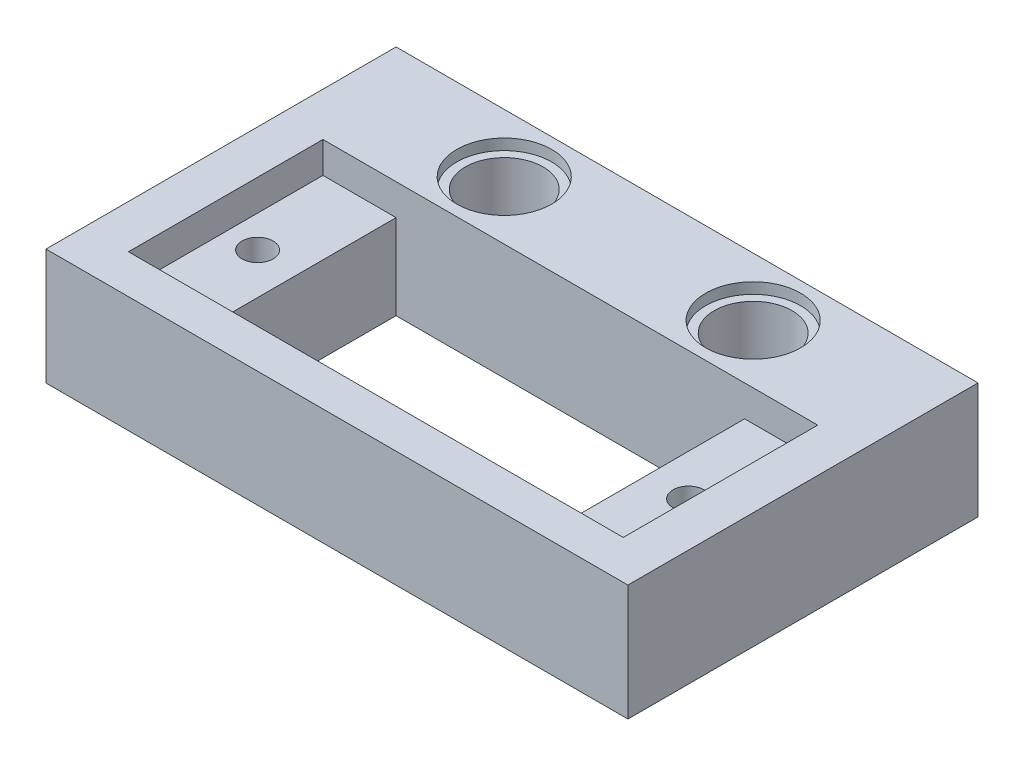
ISO-10303-21;
HEADER;
FILE_DESCRIPTION(('STEP AP214'),'2;1');
FILE_NAME('part.step','',(''),(''),'','','');
FILE_SCHEMA(('AUTOMOTIVE_DESIGN { 1 0 10303 214 1 1 1 1 }'));
ENDSEC;
DATA;
#1=APPLICATION_CONTEXT('core data for automotive mechanical design processes');
#2=APPLICATION_PROTOCOL_DEFINITION('international standard','automotive_design',2000,#1);
#3=PRODUCT_CONTEXT('',#1,'mechanical');
#4=PRODUCT('Part','Part','',(#3));
#5=PRODUCT_RELATED_PRODUCT_CATEGORY('part','',(#4));
#6=PRODUCT_DEFINITION_FORMATION('','',#4);
#7=PRODUCT_DEFINITION_CONTEXT('part definition',#1,'design');
#8=PRODUCT_DEFINITION('design','',#6,#7);
#9=PRODUCT_DEFINITION_SHAPE('','',#8);
#10=(LENGTH_UNIT() NAMED_UNIT(*) SI_UNIT(.MILLI.,.METRE.));
#11=(NAMED_UNIT(*) PLANE_ANGLE_UNIT() SI_UNIT($,.RADIAN.));
#12=(NAMED_UNIT(*) SI_UNIT($,.STERADIAN.) SOLID_ANGLE_UNIT());
#13=UNCERTAINTY_MEASURE_WITH_UNIT(LENGTH_MEASURE(1.E-05),#10,'distance_accuracy_value','');
#14=(GEOMETRIC_REPRESENTATION_CONTEXT(3) GLOBAL_UNCERTAINTY_ASSIGNED_CONTEXT((#13)) GLOBAL_UNIT_ASSIGNED_CONTEXT((#10,
#11,#12)) REPRESENTATION_CONTEXT('',''));
#15=CARTESIAN_POINT('',(0.,0.,0.));
#16=DIRECTION('',(0.,0.,1.));
#17=DIRECTION('',(1.,0.,0.));
#18=AXIS2_PLACEMENT_3D('',#15,#16,#17);
#19=CARTESIAN_POINT('',(-8.,-7.46,-10.));
#20=DIRECTION('',(0.,1.,0.));
#21=DIRECTION('',(0.,0.,1.));
#22=AXIS2_PLACEMENT_3D('',#19,#20,#21);
#23=CYLINDRICAL_SURFACE('',#22,2.5);
#24=CARTESIAN_POINT('',(-8.,-0.7,-10.));
#25=DIRECTION('',(0.,1.,0.));
#26=DIRECTION('',(0.,0.,1.));
#27=AXIS2_PLACEMENT_3D('',#24,#25,#26);
#28=CIRCLE('',#27,2.5);
#29=CARTESIAN_POINT('',(-8.,-0.7,-7.5));
#30=VERTEX_POINT('',#29);
#31=EDGE_CURVE('E155',#30,#30,#28,.F.);
#32=CARTESIAN_POINT('',(-8.,-6.76,-10.));
#33=DIRECTION('',(0.,-1.,0.));
#34=DIRECTION('',(0.,0.,-1.));
#35=AXIS2_PLACEMENT_3D('',#32,#33,#34);
#36=CIRCLE('',#35,2.5);
#37=CARTESIAN_POINT('',(-8.,-6.76,-7.5));
#38=VERTEX_POINT('',#37);
#39=EDGE_CURVE('E36',#38,#38,#36,.F.);
#40=CARTESIAN_POINT('',(-8.,-0.7,-7.5));
#41=CARTESIAN_POINT('',(-8.,-0.763125,-7.5));
#42=CARTESIAN_POINT('',(-8.,-0.82625,-7.5));
#43=CARTESIAN_POINT('',(-8.,-0.9525,-7.5));
#44=CARTESIAN_POINT('',(-8.,-1.015625,-7.5));
#45=CARTESIAN_POINT('',(-8.,-1.141875,-7.5));
#46=CARTESIAN_POINT('',(-8.,-1.205,-7.5));
#47=CARTESIAN_POINT('',(-8.,-1.33125,-7.5));
#48=CARTESIAN_POINT('',(-8.,-1.394375,-7.5));
#49=CARTESIAN_POINT('',(-8.,-1.520625,-7.5));
#50=CARTESIAN_POINT('',(-8.,-1.58375,-7.5));
#51=CARTESIAN_POINT('',(-8.,-1.71,-7.5));
#52=CARTESIAN_POINT('',(-8.,-1.773125,-7.5));
#53=CARTESIAN_POINT('',(-8.,-1.899375,-7.5));
#54=CARTESIAN_POINT('',(-8.,-1.9625,-7.5));
#55=CARTESIAN_POINT('',(-8.,-2.08875,-7.5));
#56=CARTESIAN_POINT('',(-8.,-2.151875,-7.5));
#57=CARTESIAN_POINT('',(-8.,-2.278125,-7.5));
#58=CARTESIAN_POINT('',(-8.,-2.34125,-7.5));
#59=CARTESIAN_POINT('',(-8.,-2.4675,-7.5));
#60=CARTESIAN_POINT('',(-8.,-2.530625,-7.5));
#61=CARTESIAN_POINT('',(-8.,-2.656875,-7.5));
#62=CARTESIAN_POINT('',(-8.,-2.72,-7.5));
#63=CARTESIAN_POINT('',(-8.,-2.84625,-7.5));
#64=CARTESIAN_POINT('',(-8.,-2.909375,-7.5));
#65=CARTESIAN_POINT('',(-8.,-3.035625,-7.5));
#66=CARTESIAN_POINT('',(-8.,-3.09875,-7.5));
#67=CARTESIAN_POINT('',(-8.,-3.225,-7.5));
#68=CARTESIAN_POINT('',(-8.,-3.288125,-7.5));
#69=CARTESIAN_POINT('',(-8.,-3.414375,-7.5));
#70=CARTESIAN_POINT('',(-8.,-3.4775,-7.5));
#71=CARTESIAN_POINT('',(-8.,-3.60375,-7.5));
#72=CARTESIAN_POINT('',(-8.,-3.666875,-7.5));
#73=CARTESIAN_POINT('',(-8.,-3.793125,-7.5));
#74=CARTESIAN_POINT('',(-8.,-3.85625,-7.5));
#75=CARTESIAN_POINT('',(-8.,-3.9825,-7.5));
#76=CARTESIAN_POINT('',(-8.,-4.045625,-7.5));
#77=CARTESIAN_POINT('',(-8.,-4.171875,-7.5));
#78=CARTESIAN_POINT('',(-8.,-4.235,-7.5));
#79=CARTESIAN_POINT('',(-8.,-4.36125,-7.5));
#80=CARTESIAN_POINT('',(-8.,-4.424375,-7.5));
#81=CARTESIAN_POINT('',(-8.,-4.550625,-7.5));
#82=CARTESIAN_POINT('',(-8.,-4.61375,-7.5));
#83=CARTESIAN_POINT('',(-8.,-4.74,-7.5));
#84=CARTESIAN_POINT('',(-8.,-4.803125,-7.5));
#85=CARTESIAN_POINT('',(-8.,-4.929375,-7.5));
#86=CARTESIAN_POINT('',(-8.,-4.9925,-7.5));
#87=CARTESIAN_POINT('',(-8.,-5.11875,-7.5));
#88=CARTESIAN_POINT('',(-8.,-5.181875,-7.5));
#89=CARTESIAN_POINT('',(-8.,-5.308125,-7.5));
#90=CARTESIAN_POINT('',(-8.,-5.37125,-7.5));
#91=CARTESIAN_POINT('',(-8.,-5.4975,-7.5));
#92=CARTESIAN_POINT('',(-8.,-5.560625,-7.5));
#93=CARTESIAN_POINT('',(-8.,-5.686875,-7.5));
#94=CARTESIAN_POINT('',(-8.,-5.75,-7.5));
#95=CARTESIAN_POINT('',(-8.,-5.87625,-7.5));
#96=CARTESIAN_POINT('',(-8.,-5.939375,-7.5));
#97=CARTESIAN_POINT('',(-8.,-6.065625,-7.5));
#98=CARTESIAN_POINT('',(-8.,-6.12875,-7.5));
#99=CARTESIAN_POINT('',(-8.,-6.255,-7.5));
#100=CARTESIAN_POINT('',(-8.,-6.318125,-7.5));
#101=CARTESIAN_POINT('',(-8.,-6.444375,-7.5));
#102=CARTESIAN_POINT('',(-8.,-6.5075,-7.5));
#103=CARTESIAN_POINT('',(-8.,-6.63375,-7.5));
#104=CARTESIAN_POINT('',(-8.,-6.696875,-7.5));
#105=CARTESIAN_POINT('',(-8.,-6.76,-7.5));
#106=B_SPLINE_CURVE_WITH_KNOTS('',3,(#40,#41,#42,#43,#44,#45,#46,#47,#48,#49,#50,#51,#52,#53,
#54,#55,#56,#57,#58,#59,#60,#61,#62,#63,#64,#65,#66,#67,#68,#69,#70,#71,#72,#73,#74,#75,#76,#77,
#78,#79,#80,#81,#82,#83,#84,#85,#86,#87,#88,#89,#90,#91,#92,#93,#94,#95,#96,#97,#98,#99,#100,
#101,#102,#103,#104,#105),.UNSPECIFIED.,.F.,.F.,(4,2,2,2,2,2,2,2,2,2,2,2,2,2,2,2,2,2,2,2,2,2,2,
2,2,2,2,2,2,2,2,2,4),(0.,0.189375,0.37875,0.568125,0.7575,0.946875,1.13625,1.325625,1.515,
1.704375,1.89375,2.083125,2.2725,2.461875,2.65125,2.840625,3.03,3.219375,3.40875,3.598125,
3.7875,3.976875,4.16625,4.355625,4.545,4.734375,4.92375,5.113125,5.3025,5.491875,5.68125,
5.870625,6.06),.UNSPECIFIED.);
#107=EDGE_CURVE('BSEAM32',#30,#38,#106,.T.);
#108=ORIENTED_EDGE('',*,*,#31,.F.);
#109=ORIENTED_EDGE('',*,*,#39,.F.);
#110=ORIENTED_EDGE('',*,*,#107,.T.);
#111=ORIENTED_EDGE('',*,*,#107,.F.);
#112=EDGE_LOOP('',(#108,#110,#109,#111));
#113=FACE_BOUND('',#112,.T.);
#114=ADVANCED_FACE('F32',(#113),#23,.F.);
#115=CARTESIAN_POINT('',(8.,-7.46,-10.));
#116=DIRECTION('',(0.,1.,0.));
#117=DIRECTION('',(0.,0.,1.));
#118=AXIS2_PLACEMENT_3D('',#115,#116,#117);
#119=CYLINDRICAL_SURFACE('',#118,2.5);
#120=CARTESIAN_POINT('',(8.,-0.7,-10.));
#121=DIRECTION('',(0.,1.,0.));
#122=DIRECTION('',(0.,0.,1.));
#123=AXIS2_PLACEMENT_3D('',#120,#121,#122);
#124=CIRCLE('',#123,2.5);
#125=CARTESIAN_POINT('',(8.,-0.7,-7.5));
#126=VERTEX_POINT('',#125);
#127=EDGE_CURVE('E238',#126,#126,#124,.F.);
#128=CARTESIAN_POINT('',(8.,-6.76,-10.));
#129=DIRECTION('',(0.,-1.,0.));
#130=DIRECTION('',(0.,0.,-1.));
#131=AXIS2_PLACEMENT_3D('',#128,#129,#130);
#132=CIRCLE('',#131,2.5);
#133=CARTESIAN_POINT('',(8.,-6.76,-7.5));
#134=VERTEX_POINT('',#133);
#135=EDGE_CURVE('E241',#134,#134,#132,.F.);
#136=CARTESIAN_POINT('',(8.,-0.7,-7.5));
#137=CARTESIAN_POINT('',(8.,-0.763125,-7.5));
#138=CARTESIAN_POINT('',(8.,-0.82625,-7.5));
#139=CARTESIAN_POINT('',(8.,-0.9525,-7.5));
#140=CARTESIAN_POINT('',(8.,-1.015625,-7.5));
#141=CARTESIAN_POINT('',(8.,-1.141875,-7.5));
#142=CARTESIAN_POINT('',(8.,-1.205,-7.5));
#143=CARTESIAN_POINT('',(8.,-1.33125,-7.5));
#144=CARTESIAN_POINT('',(8.,-1.394375,-7.5));
#145=CARTESIAN_POINT('',(8.,-1.520625,-7.5));
#146=CARTESIAN_POINT('',(8.,-1.58375,-7.5));
#147=CARTESIAN_POINT('',(8.,-1.71,-7.5));
#148=CARTESIAN_POINT('',(8.,-1.773125,-7.5));
#149=CARTESIAN_POINT('',(8.,-1.899375,-7.5));
#150=CARTESIAN_POINT('',(8.,-1.9625,-7.5));
#151=CARTESIAN_POINT('',(8.,-2.08875,-7.5));
#152=CARTESIAN_POINT('',(8.,-2.151875,-7.5));
#153=CARTESIAN_POINT('',(8.,-2.278125,-7.5));
#154=CARTESIAN_POINT('',(8.,-2.34125,-7.5));
#155=CARTESIAN_POINT('',(8.,-2.4675,-7.5));
#156=CARTESIAN_POINT('',(8.,-2.530625,-7.5));
#157=CARTESIAN_POINT('',(8.,-2.656875,-7.5));
#158=CARTESIAN_POINT('',(8.,-2.72,-7.5));
#159=CARTESIAN_POINT('',(8.,-2.84625,-7.5));
#160=CARTESIAN_POINT('',(8.,-2.909375,-7.5));
#161=CARTESIAN_POINT('',(8.,-3.035625,-7.5));
#162=CARTESIAN_POINT('',(8.,-3.09875,-7.5));
#163=CARTESIAN_POINT('',(8.,-3.225,-7.5));
#164=CARTESIAN_POINT('',(8.,-3.288125,-7.5));
#165=CARTESIAN_POINT('',(8.,-3.414375,-7.5));
#166=CARTESIAN_POINT('',(8.,-3.4775,-7.5));
#167=CARTESIAN_POINT('',(8.,-3.60375,-7.5));
#168=CARTESIAN_POINT('',(8.,-3.666875,-7.5));
#169=CARTESIAN_POINT('',(8.,-3.793125,-7.5));
#170=CARTESIAN_POINT('',(8.,-3.85625,-7.5));
#171=CARTESIAN_POINT('',(8.,-3.9825,-7.5));
#172=CARTESIAN_POINT('',(8.,-4.045625,-7.5));
#173=CARTESIAN_POINT('',(8.,-4.171875,-7.5));
#174=CARTESIAN_POINT('',(8.,-4.235,-7.5));
#175=CARTESIAN_POINT('',(8.,-4.36125,-7.5));
#176=CARTESIAN_POINT('',(8.,-4.424375,-7.5));
#177=CARTESIAN_POINT('',(8.,-4.550625,-7.5));
#178=CARTESIAN_POINT('',(8.,-4.61375,-7.5));
#179=CARTESIAN_POINT('',(8.,-4.74,-7.5));
#180=CARTESIAN_POINT('',(8.,-4.803125,-7.5));
#181=CARTESIAN_POINT('',(8.,-4.929375,-7.5));
#182=CARTESIAN_POINT('',(8.,-4.9925,-7.5));
#183=CARTESIAN_POINT('',(8.,-5.11875,-7.5));
#184=CARTESIAN_POINT('',(8.,-5.181875,-7.5));
#185=CARTESIAN_POINT('',(8.,-5.308125,-7.5));
#186=CARTESIAN_POINT('',(8.,-5.37125,-7.5));
#187=CARTESIAN_POINT('',(8.,-5.4975,-7.5));
#188=CARTESIAN_POINT('',(8.,-5.560625,-7.5));
#189=CARTESIAN_POINT('',(8.,-5.686875,-7.5));
#190=CARTESIAN_POINT('',(8.,-5.75,-7.5));
#191=CARTESIAN_POINT('',(8.,-5.87625,-7.5));
#192=CARTESIAN_POINT('',(8.,-5.939375,-7.5));
#193=CARTESIAN_POINT('',(8.,-6.065625,-7.5));
#194=CARTESIAN_POINT('',(8.,-6.12875,-7.5));
#195=CARTESIAN_POINT('',(8.,-6.255,-7.5));
#196=CARTESIAN_POINT('',(8.,-6.318125,-7.5));
#197=CARTESIAN_POINT('',(8.,-6.444375,-7.5));
#198=CARTESIAN_POINT('',(8.,-6.5075,-7.5));
#199=CARTESIAN_POINT('',(8.,-6.63375,-7.5));
#200=CARTESIAN_POINT('',(8.,-6.696875,-7.5));
#201=CARTESIAN_POINT('',(8.,-6.76,-7.5));
#202=B_SPLINE_CURVE_WITH_KNOTS('',3,(#136,#137,#138,#139,#140,#141,#142,#143,#144,#145,#146,
#147,#148,#149,#150,#151,#152,#153,#154,#155,#156,#157,#158,#159,#160,#161,#162,#163,#164,#165,
#166,#167,#168,#169,#170,#171,#172,#173,#174,#175,#176,#177,#178,#179,#180,#181,#182,#183,#184,
#185,#186,#187,#188,#189,#190,#191,#192,#193,#194,#195,#196,#197,#198,#199,#200,#201),
.UNSPECIFIED.,.F.,.F.,(4,2,2,2,2,2,2,2,2,2,2,2,2,2,2,2,2,2,2,2,2,2,2,2,2,2,2,2,2,2,2,2,4),(0.,
0.189375,0.37875,0.568125,0.7575,0.946875,1.13625,1.325625,1.515,1.704375,1.89375,2.083125,
2.2725,2.461875,2.65125,2.840625,3.03,3.219375,3.40875,3.598125,3.7875,3.976875,4.16625,
4.355625,4.545,4.734375,4.92375,5.113125,5.3025,5.491875,5.68125,5.870625,6.06),.UNSPECIFIED.);
#203=EDGE_CURVE('BSEAM303',#126,#134,#202,.T.);
#204=ORIENTED_EDGE('',*,*,#127,.F.);
#205=ORIENTED_EDGE('',*,*,#135,.F.);
#206=ORIENTED_EDGE('',*,*,#203,.T.);
#207=ORIENTED_EDGE('',*,*,#203,.F.);
#208=EDGE_LOOP('',(#204,#206,#205,#207));
#209=FACE_BOUND('',#208,.T.);
#210=ADVANCED_FACE('F303',(#209),#119,.F.);
#211=CARTESIAN_POINT('',(11.2,-7.46,-6.25));
#212=DIRECTION('',(1.,0.,0.));
#213=DIRECTION('',(0.,0.,-1.));
#214=AXIS2_PLACEMENT_3D('',#211,#212,#213);
#215=PLANE('',#214);
#216=DIRECTION('',(0.,0.,1.));
#217=VECTOR('',#216,1.);
#218=CARTESIAN_POINT('',(11.2,-2.,-6.25));
#219=LINE('',#218,#217);
#220=CARTESIAN_POINT('',(11.2,-2.,-6.25));
#221=VERTEX_POINT('',#220);
#222=CARTESIAN_POINT('',(11.2,-2.,6.25));
#223=VERTEX_POINT('',#222);
#224=EDGE_CURVE('E170',#221,#223,#219,.T.);
#225=ORIENTED_EDGE('',*,*,#224,.F.);
#226=DIRECTION('',(0.,1.,0.));
#227=VECTOR('',#226,1.);
#228=CARTESIAN_POINT('',(11.2,-7.46,-6.25));
#229=LINE('',#228,#227);
#230=CARTESIAN_POINT('',(11.2,-7.46,-6.25));
#231=VERTEX_POINT('',#230);
#232=EDGE_CURVE('E137',#231,#221,#229,.T.);
#233=ORIENTED_EDGE('',*,*,#232,.F.);
#234=DIRECTION('',(0.,0.,-1.));
#235=VECTOR('',#234,1.);
#236=CARTESIAN_POINT('',(11.2,-7.46,-6.25));
#237=LINE('',#236,#235);
#238=CARTESIAN_POINT('',(11.2,-7.46,6.25));
#239=VERTEX_POINT('',#238);
#240=EDGE_CURVE('E179',#239,#231,#237,.T.);
#241=ORIENTED_EDGE('',*,*,#240,.F.);
#242=DIRECTION('',(0.,1.,0.));
#243=VECTOR('',#242,1.);
#244=CARTESIAN_POINT('',(11.2,-7.46,6.25));
#245=LINE('',#244,#243);
#246=EDGE_CURVE('E194',#239,#223,#245,.T.);
#247=ORIENTED_EDGE('',*,*,#246,.T.);
#248=EDGE_LOOP('',(#225,#233,#241,#247));
#249=FACE_BOUND('',#248,.T.);
#250=ADVANCED_FACE('F309',(#249),#215,.F.);
#251=CARTESIAN_POINT('',(-11.2,-7.46,-6.25));
#252=DIRECTION('',(-1.,0.,0.));
#253=DIRECTION('',(0.,0.,1.));
#254=AXIS2_PLACEMENT_3D('',#251,#252,#253);
#255=PLANE('',#254);
#256=DIRECTION('',(0.,0.,-1.));
#257=VECTOR('',#256,1.);
#258=CARTESIAN_POINT('',(-11.2,-2.,-6.25));
#259=LINE('',#258,#257);
#260=CARTESIAN_POINT('',(-11.2,-2.,6.25));
#261=VERTEX_POINT('',#260);
#262=CARTESIAN_POINT('',(-11.2,-2.,-6.25));
#263=VERTEX_POINT('',#262);
#264=EDGE_CURVE('E168',#261,#263,#259,.T.);
#265=ORIENTED_EDGE('',*,*,#264,.F.);
#266=DIRECTION('',(0.,1.,0.));
#267=VECTOR('',#266,1.);
#268=CARTESIAN_POINT('',(-11.2,-7.46,6.25));
#269=LINE('',#268,#267);
#270=CARTESIAN_POINT('',(-11.2,-7.46,6.25));
#271=VERTEX_POINT('',#270);
#272=EDGE_CURVE('E198',#271,#261,#269,.T.);
#273=ORIENTED_EDGE('',*,*,#272,.F.);
#274=DIRECTION('',(0.,0.,1.));
#275=VECTOR('',#274,1.);
#276=CARTESIAN_POINT('',(-11.2,-7.46,-6.25));
#277=LINE('',#276,#275);
#278=CARTESIAN_POINT('',(-11.2,-7.46,-6.25));
#279=VERTEX_POINT('',#278);
#280=EDGE_CURVE('E186',#279,#271,#277,.T.);
#281=ORIENTED_EDGE('',*,*,#280,.F.);
#282=DIRECTION('',(0.,1.,0.));
#283=VECTOR('',#282,1.);
#284=CARTESIAN_POINT('',(-11.2,-7.46,-6.25));
#285=LINE('',#284,#283);
#286=EDGE_CURVE('E201',#279,#263,#285,.T.);
#287=ORIENTED_EDGE('',*,*,#286,.T.);
#288=EDGE_LOOP('',(#265,#273,#281,#287));
#289=FACE_BOUND('',#288,.T.);
#290=ADVANCED_FACE('F335',(#289),#255,.F.);
#291=CARTESIAN_POINT('',(13.85,-7.46,0.));
#292=DIRECTION('',(0.,1.,0.));
#293=DIRECTION('',(0.,0.,1.));
#294=AXIS2_PLACEMENT_3D('',#291,#292,#293);
#295=CYLINDRICAL_SURFACE('',#294,1.);
#296=CARTESIAN_POINT('',(13.85,-7.46,0.));
#297=DIRECTION('',(0.,1.,0.));
#298=DIRECTION('',(0.,0.,1.));
#299=AXIS2_PLACEMENT_3D('',#296,#297,#298);
#300=CIRCLE('',#299,1.);
#301=CARTESIAN_POINT('',(13.85,-7.46,1.));
#302=VERTEX_POINT('',#301);
#303=EDGE_CURVE('E175',#302,#302,#300,.T.);
#304=CARTESIAN_POINT('',(13.85,-2.,0.));
#305=DIRECTION('',(0.,1.,0.));
#306=DIRECTION('',(0.,0.,1.));
#307=AXIS2_PLACEMENT_3D('',#304,#305,#306);
#308=CIRCLE('',#307,1.);
#309=CARTESIAN_POINT('',(13.85,-2.,1.));
#310=VERTEX_POINT('',#309);
#311=EDGE_CURVE('E165',#310,#310,#308,.F.);
#312=CARTESIAN_POINT('',(13.85,-7.46,1.));
#313=CARTESIAN_POINT('',(13.85,-7.403125,1.));
#314=CARTESIAN_POINT('',(13.85,-7.34625,1.));
#315=CARTESIAN_POINT('',(13.85,-7.2325,1.));
#316=CARTESIAN_POINT('',(13.85,-7.175625,1.));
#317=CARTESIAN_POINT('',(13.85,-7.061875,1.));
#318=CARTESIAN_POINT('',(13.85,-7.005,1.));
#319=CARTESIAN_POINT('',(13.85,-6.89125,1.));
#320=CARTESIAN_POINT('',(13.85,-6.834375,1.));
#321=CARTESIAN_POINT('',(13.85,-6.720625,1.));
#322=CARTESIAN_POINT('',(13.85,-6.66375,1.));
#323=CARTESIAN_POINT('',(13.85,-6.55,1.));
#324=CARTESIAN_POINT('',(13.85,-6.493125,1.));
#325=CARTESIAN_POINT('',(13.85,-6.379375,1.));
#326=CARTESIAN_POINT('',(13.85,-6.3225,1.));
#327=CARTESIAN_POINT('',(13.85,-6.20875,1.));
#328=CARTESIAN_POINT('',(13.85,-6.151875,1.));
#329=CARTESIAN_POINT('',(13.85,-6.038125,1.));
#330=CARTESIAN_POINT('',(13.85,-5.98125,1.));
#331=CARTESIAN_POINT('',(13.85,-5.8675,1.));
#332=CARTESIAN_POINT('',(13.85,-5.810625,1.));
#333=CARTESIAN_POINT('',(13.85,-5.696875,1.));
#334=CARTESIAN_POINT('',(13.85,-5.64,1.));
#335=CARTESIAN_POINT('',(13.85,-5.52625,1.));
#336=CARTESIAN_POINT('',(13.85,-5.469375,1.));
#337=CARTESIAN_POINT('',(13.85,-5.355625,1.));
#338=CARTESIAN_POINT('',(13.85,-5.29875,1.));
#339=CARTESIAN_POINT('',(13.85,-5.185,1.));
#340=CARTESIAN_POINT('',(13.85,-5.128125,1.));
#341=CARTESIAN_POINT('',(13.85,-5.014375,1.));
#342=CARTESIAN_POINT('',(13.85,-4.9575,1.));
#343=CARTESIAN_POINT('',(13.85,-4.84375,1.));
#344=CARTESIAN_POINT('',(13.85,-4.786875,1.));
#345=CARTESIAN_POINT('',(13.85,-4.673125,1.));
#346=CARTESIAN_POINT('',(13.85,-4.61625,1.));
#347=CARTESIAN_POINT('',(13.85,-4.5025,1.));
#348=CARTESIAN_POINT('',(13.85,-4.445625,1.));
#349=CARTESIAN_POINT('',(13.85,-4.331875,1.));
#350=CARTESIAN_POINT('',(13.85,-4.275,1.));
#351=CARTESIAN_POINT('',(13.85,-4.16125,1.));
#352=CARTESIAN_POINT('',(13.85,-4.104375,1.));
#353=CARTESIAN_POINT('',(13.85,-3.990625,1.));
#354=CARTESIAN_POINT('',(13.85,-3.93375,1.));
#355=CARTESIAN_POINT('',(13.85,-3.82,1.));
#356=CARTESIAN_POINT('',(13.85,-3.763125,1.));
#357=CARTESIAN_POINT('',(13.85,-3.649375,1.));
#358=CARTESIAN_POINT('',(13.85,-3.5925,1.));
#359=CARTESIAN_POINT('',(13.85,-3.47875,1.));
#360=CARTESIAN_POINT('',(13.85,-3.421875,1.));
#361=CARTESIAN_POINT('',(13.85,-3.308125,1.));
#362=CARTESIAN_POINT('',(13.85,-3.25125,1.));
#363=CARTESIAN_POINT('',(13.85,-3.1375,1.));
#364=CARTESIAN_POINT('',(13.85,-3.080625,1.));
#365=CARTESIAN_POINT('',(13.85,-2.966875,1.));
#366=CARTESIAN_POINT('',(13.85,-2.91,1.));
#367=CARTESIAN_POINT('',(13.85,-2.79625,1.));
#368=CARTESIAN_POINT('',(13.85,-2.739375,1.));
#369=CARTESIAN_POINT('',(13.85,-2.625625,1.));
#370=CARTESIAN_POINT('',(13.85,-2.56875,1.));
#371=CARTESIAN_POINT('',(13.85,-2.455,1.));
#372=CARTESIAN_POINT('',(13.85,-2.398125,1.));
#373=CARTESIAN_POINT('',(13.85,-2.284375,1.));
#374=CARTESIAN_POINT('',(13.85,-2.2275,1.));
#375=CARTESIAN_POINT('',(13.85,-2.11375,1.));
#376=CARTESIAN_POINT('',(13.85,-2.056875,1.));
#377=CARTESIAN_POINT('',(13.85,-2.,1.));
#378=B_SPLINE_CURVE_WITH_KNOTS('',3,(#312,#313,#314,#315,#316,#317,#318,#319,#320,#321,#322,
#323,#324,#325,#326,#327,#328,#329,#330,#331,#332,#333,#334,#335,#336,#337,#338,#339,#340,#341,
#342,#343,#344,#345,#346,#347,#348,#349,#350,#351,#352,#353,#354,#355,#356,#357,#358,#359,#360,
#361,#362,#363,#364,#365,#366,#367,#368,#369,#370,#371,#372,#373,#374,#375,#376,#377),
.UNSPECIFIED.,.F.,.F.,(4,2,2,2,2,2,2,2,2,2,2,2,2,2,2,2,2,2,2,2,2,2,2,2,2,2,2,2,2,2,2,2,4),(0.,
0.170625000000001,0.34125,0.511875,0.6825,0.853125000000001,1.02375,1.194375,1.365,1.535625,
1.70625,1.876875,2.0475,2.218125,2.38875,2.559375,2.73,2.900625,3.07125,3.241875,3.4125,
3.583125,3.75375,3.924375,4.095,4.265625,4.43625,4.606875,4.7775,4.948125,5.11875,5.289375,
5.46),.UNSPECIFIED.);
#379=EDGE_CURVE('BSEAM331',#302,#310,#378,.T.);
#380=ORIENTED_EDGE('',*,*,#303,.F.);
#381=ORIENTED_EDGE('',*,*,#311,.F.);
#382=ORIENTED_EDGE('',*,*,#379,.T.);
#383=ORIENTED_EDGE('',*,*,#379,.F.);
#384=EDGE_LOOP('',(#380,#382,#381,#383));
#385=FACE_BOUND('',#384,.T.);
#386=ADVANCED_FACE('F331',(#385),#295,.F.);
#387=CARTESIAN_POINT('',(-13.85,-7.46,0.));
#388=DIRECTION('',(0.,1.,0.));
#389=DIRECTION('',(0.,0.,1.));
#390=AXIS2_PLACEMENT_3D('',#387,#388,#389);
#391=CYLINDRICAL_SURFACE('',#390,1.);
#392=CARTESIAN_POINT('',(-13.85,-7.46,0.));
#393=DIRECTION('',(0.,1.,0.));
#394=DIRECTION('',(0.,0.,-1.));
#395=AXIS2_PLACEMENT_3D('',#392,#393,#394);
#396=CIRCLE('',#395,1.);
#397=CARTESIAN_POINT('',(-13.85,-7.46,1.00000000000001));
#398=VERTEX_POINT('',#397);
#399=EDGE_CURVE('E172',#398,#398,#396,.T.);
#400=CARTESIAN_POINT('',(-13.85,-2.,0.));
#401=DIRECTION('',(0.,1.,0.));
#402=DIRECTION('',(0.,0.,1.));
#403=AXIS2_PLACEMENT_3D('',#400,#401,#402);
#404=CIRCLE('',#403,1.);
#405=CARTESIAN_POINT('',(-13.85,-2.,1.00000000000001));
#406=VERTEX_POINT('',#405);
#407=EDGE_CURVE('E159',#406,#406,#404,.F.);
#408=CARTESIAN_POINT('',(-13.85,-7.46,1.00000000000001));
#409=CARTESIAN_POINT('',(-13.85,-7.403125,1.00000000000001));
#410=CARTESIAN_POINT('',(-13.85,-7.34625,1.00000000000001));
#411=CARTESIAN_POINT('',(-13.85,-7.2325,1.00000000000001));
#412=CARTESIAN_POINT('',(-13.85,-7.175625,1.00000000000001));
#413=CARTESIAN_POINT('',(-13.85,-7.061875,1.00000000000001));
#414=CARTESIAN_POINT('',(-13.85,-7.005,1.00000000000001));
#415=CARTESIAN_POINT('',(-13.85,-6.89125,1.00000000000001));
#416=CARTESIAN_POINT('',(-13.85,-6.834375,1.00000000000001));
#417=CARTESIAN_POINT('',(-13.85,-6.720625,1.00000000000001));
#418=CARTESIAN_POINT('',(-13.85,-6.66375,1.00000000000001));
#419=CARTESIAN_POINT('',(-13.85,-6.55,1.00000000000001));
#420=CARTESIAN_POINT('',(-13.85,-6.493125,1.00000000000001));
#421=CARTESIAN_POINT('',(-13.85,-6.379375,1.00000000000001));
#422=CARTESIAN_POINT('',(-13.85,-6.3225,1.00000000000001));
#423=CARTESIAN_POINT('',(-13.85,-6.20875,1.00000000000001));
#424=CARTESIAN_POINT('',(-13.85,-6.151875,1.00000000000001));
#425=CARTESIAN_POINT('',(-13.85,-6.038125,1.00000000000001));
#426=CARTESIAN_POINT('',(-13.85,-5.98125,1.00000000000001));
#427=CARTESIAN_POINT('',(-13.85,-5.8675,1.00000000000001));
#428=CARTESIAN_POINT('',(-13.85,-5.810625,1.00000000000001));
#429=CARTESIAN_POINT('',(-13.85,-5.696875,1.00000000000001));
#430=CARTESIAN_POINT('',(-13.85,-5.64,1.00000000000001));
#431=CARTESIAN_POINT('',(-13.85,-5.52625,1.00000000000001));
#432=CARTESIAN_POINT('',(-13.85,-5.469375,1.00000000000001));
#433=CARTESIAN_POINT('',(-13.85,-5.355625,1.00000000000001));
#434=CARTESIAN_POINT('',(-13.85,-5.29875,1.00000000000001));
#435=CARTESIAN_POINT('',(-13.85,-5.185,1.00000000000001));
#436=CARTESIAN_POINT('',(-13.85,-5.128125,1.00000000000001));
#437=CARTESIAN_POINT('',(-13.85,-5.014375,1.00000000000001));
#438=CARTESIAN_POINT('',(-13.85,-4.9575,1.00000000000001));
#439=CARTESIAN_POINT('',(-13.85,-4.84375,1.00000000000001));
#440=CARTESIAN_POINT('',(-13.85,-4.786875,1.00000000000001));
#441=CARTESIAN_POINT('',(-13.85,-4.673125,1.00000000000001));
#442=CARTESIAN_POINT('',(-13.85,-4.61625,1.00000000000001));
#443=CARTESIAN_POINT('',(-13.85,-4.5025,1.00000000000001));
#444=CARTESIAN_POINT('',(-13.85,-4.445625,1.00000000000001));
#445=CARTESIAN_POINT('',(-13.85,-4.331875,1.00000000000001));
#446=CARTESIAN_POINT('',(-13.85,-4.275,1.00000000000001));
#447=CARTESIAN_POINT('',(-13.85,-4.16125,1.00000000000001));
#448=CARTESIAN_POINT('',(-13.85,-4.104375,1.00000000000001));
#449=CARTESIAN_POINT('',(-13.85,-3.990625,1.00000000000001));
#450=CARTESIAN_POINT('',(-13.85,-3.93375,1.00000000000001));
#451=CARTESIAN_POINT('',(-13.85,-3.82,1.00000000000001));
#452=CARTESIAN_POINT('',(-13.85,-3.763125,1.00000000000001));
#453=CARTESIAN_POINT('',(-13.85,-3.649375,1.00000000000001));
#454=CARTESIAN_POINT('',(-13.85,-3.5925,1.00000000000001));
#455=CARTESIAN_POINT('',(-13.85,-3.47875,1.00000000000001));
#456=CARTESIAN_POINT('',(-13.85,-3.421875,1.00000000000001));
#457=CARTESIAN_POINT('',(-13.85,-3.308125,1.00000000000001));
#458=CARTESIAN_POINT('',(-13.85,-3.25125,1.00000000000001));
#459=CARTESIAN_POINT('',(-13.85,-3.1375,1.00000000000001));
#460=CARTESIAN_POINT('',(-13.85,-3.080625,1.00000000000001));
#461=CARTESIAN_POINT('',(-13.85,-2.966875,1.00000000000001));
#462=CARTESIAN_POINT('',(-13.85,-2.91,1.00000000000001));
#463=CARTESIAN_POINT('',(-13.85,-2.79625,1.00000000000001));
#464=CARTESIAN_POINT('',(-13.85,-2.739375,1.00000000000001));
#465=CARTESIAN_POINT('',(-13.85,-2.625625,1.00000000000001));
#466=CARTESIAN_POINT('',(-13.85,-2.56875,1.00000000000001));
#467=CARTESIAN_POINT('',(-13.85,-2.455,1.00000000000001));
#468=CARTESIAN_POINT('',(-13.85,-2.398125,1.00000000000001));
#469=CARTESIAN_POINT('',(-13.85,-2.284375,1.00000000000001));
#470=CARTESIAN_POINT('',(-13.85,-2.2275,1.00000000000001));
#471=CARTESIAN_POINT('',(-13.85,-2.11375,1.00000000000001));
#472=CARTESIAN_POINT('',(-13.85,-2.056875,1.00000000000001));
#473=CARTESIAN_POINT('',(-13.85,-2.,1.00000000000001));
#474=B_SPLINE_CURVE_WITH_KNOTS('',3,(#408,#409,#410,#411,#412,#413,#414,#415,#416,#417,#418,
#419,#420,#421,#422,#423,#424,#425,#426,#427,#428,#429,#430,#431,#432,#433,#434,#435,#436,#437,
#438,#439,#440,#441,#442,#443,#444,#445,#446,#447,#448,#449,#450,#451,#452,#453,#454,#455,#456,
#457,#458,#459,#460,#461,#462,#463,#464,#465,#466,#467,#468,#469,#470,#471,#472,#473),
.UNSPECIFIED.,.F.,.F.,(4,2,2,2,2,2,2,2,2,2,2,2,2,2,2,2,2,2,2,2,2,2,2,2,2,2,2,2,2,2,2,2,4),(0.,
0.170625000000001,0.34125,0.511875,0.6825,0.853125000000001,1.02375,1.194375,1.365,1.535625,
1.70625,1.876875,2.0475,2.218125,2.38875,2.559375,2.73,2.900625,3.07125,3.241875,3.4125,
3.583125,3.75375,3.924375,4.095,4.265625,4.43625,4.606875,4.7775,4.948125,5.11875,5.289375,
5.46),.UNSPECIFIED.);
#475=EDGE_CURVE('BSEAM328',#398,#406,#474,.T.);
#476=ORIENTED_EDGE('',*,*,#399,.F.);
#477=ORIENTED_EDGE('',*,*,#407,.F.);
#478=ORIENTED_EDGE('',*,*,#475,.T.);
#479=ORIENTED_EDGE('',*,*,#475,.F.);
#480=EDGE_LOOP('',(#476,#478,#477,#479));
#481=FACE_BOUND('',#480,.T.);
#482=ADVANCED_FACE('F328',(#481),#391,.F.);
#483=CARTESIAN_POINT('',(18.7,-7.46,-13.75));
#484=DIRECTION('',(0.,0.,-1.));
#485=DIRECTION('',(-1.,0.,0.));
#486=AXIS2_PLACEMENT_3D('',#483,#484,#485);
#487=PLANE('',#486);
#488=DIRECTION('',(-1.,0.,0.));
#489=VECTOR('',#488,1.);
#490=CARTESIAN_POINT('',(18.7,0.,-13.75));
#491=LINE('',#490,#489);
#492=CARTESIAN_POINT('',(18.7,0.,-13.75));
#493=VERTEX_POINT('',#492);
#494=CARTESIAN_POINT('',(-18.7,0.,-13.75));
#495=VERTEX_POINT('',#494);
#496=EDGE_CURVE('E197',#493,#495,#491,.T.);
#497=ORIENTED_EDGE('',*,*,#496,.F.);
#498=DIRECTION('',(0.,1.,0.));
#499=VECTOR('',#498,1.);
#500=CARTESIAN_POINT('',(18.7,-7.46,-13.75));
#501=LINE('',#500,#499);
#502=CARTESIAN_POINT('',(18.7,-7.46,-13.75));
#503=VERTEX_POINT('',#502);
#504=EDGE_CURVE('E11',#503,#493,#501,.T.);
#505=ORIENTED_EDGE('',*,*,#504,.F.);
#506=DIRECTION('',(-1.,0.,0.));
#507=VECTOR('',#506,1.);
#508=CARTESIAN_POINT('',(18.7,-7.46,-13.75));
#509=LINE('',#508,#507);
#510=CARTESIAN_POINT('',(-18.7,-7.46,-13.75));
#511=VERTEX_POINT('',#510);
#512=EDGE_CURVE('E205',#503,#511,#509,.T.);
#513=ORIENTED_EDGE('',*,*,#512,.T.);
#514=DIRECTION('',(0.,1.,0.));
#515=VECTOR('',#514,1.);
#516=CARTESIAN_POINT('',(-18.7,-7.46,-13.75));
#517=LINE('',#516,#515);
#518=EDGE_CURVE('E218',#511,#495,#517,.T.);
#519=ORIENTED_EDGE('',*,*,#518,.T.);
#520=EDGE_LOOP('',(#497,#505,#513,#519));
#521=FACE_BOUND('',#520,.T.);
#522=ADVANCED_FACE('F34',(#521),#487,.T.);
#523=CARTESIAN_POINT('',(18.7,-7.46,8.75));
#524=DIRECTION('',(1.,0.,0.));
#525=DIRECTION('',(0.,0.,-1.));
#526=AXIS2_PLACEMENT_3D('',#523,#524,#525);
#527=PLANE('',#526);
#528=DIRECTION('',(0.,0.,-1.));
#529=VECTOR('',#528,1.);
#530=CARTESIAN_POINT('',(18.7,0.,8.75));
#531=LINE('',#530,#529);
#532=CARTESIAN_POINT('',(18.7,0.,8.75));
#533=VERTEX_POINT('',#532);
#534=EDGE_CURVE('E209',#533,#493,#531,.T.);
#535=ORIENTED_EDGE('',*,*,#534,.F.);
#536=DIRECTION('',(0.,1.,0.));
#537=VECTOR('',#536,1.);
#538=CARTESIAN_POINT('',(18.7,-7.46,8.75));
#539=LINE('',#538,#537);
#540=CARTESIAN_POINT('',(18.7,-7.46,8.75));
#541=VERTEX_POINT('',#540);
#542=EDGE_CURVE('E41',#541,#533,#539,.T.);
#543=ORIENTED_EDGE('',*,*,#542,.F.);
#544=DIRECTION('',(0.,0.,-1.));
#545=VECTOR('',#544,1.);
#546=CARTESIAN_POINT('',(18.7,-7.46,8.75));
#547=LINE('',#546,#545);
#548=EDGE_CURVE('E215',#541,#503,#547,.T.);
#549=ORIENTED_EDGE('',*,*,#548,.T.);
#550=ORIENTED_EDGE('',*,*,#504,.T.);
#551=EDGE_LOOP('',(#535,#543,#549,#550));
#552=FACE_BOUND('',#551,.T.);
#553=ADVANCED_FACE('F290',(#552),#527,.T.);
#554=CARTESIAN_POINT('',(-18.7,-7.46,8.75));
#555=DIRECTION('',(0.,0.,1.));
#556=DIRECTION('',(1.,0.,0.));
#557=AXIS2_PLACEMENT_3D('',#554,#555,#556);
#558=PLANE('',#557);
#559=DIRECTION('',(1.,0.,0.));
#560=VECTOR('',#559,1.);
#561=CARTESIAN_POINT('',(-18.7,0.,8.75));
#562=LINE('',#561,#560);
#563=CARTESIAN_POINT('',(-18.7,0.,8.75));
#564=VERTEX_POINT('',#563);
#565=EDGE_CURVE('E224',#564,#533,#562,.T.);
#566=ORIENTED_EDGE('',*,*,#565,.F.);
#567=DIRECTION('',(0.,1.,0.));
#568=VECTOR('',#567,1.);
#569=CARTESIAN_POINT('',(-18.7,-7.46,8.75));
#570=LINE('',#569,#568);
#571=CARTESIAN_POINT('',(-18.7,-7.46,8.75));
#572=VERTEX_POINT('',#571);
#573=EDGE_CURVE('E230',#572,#564,#570,.T.);
#574=ORIENTED_EDGE('',*,*,#573,.F.);
#575=DIRECTION('',(1.,0.,0.));
#576=VECTOR('',#575,1.);
#577=CARTESIAN_POINT('',(-18.7,-7.46,8.75));
#578=LINE('',#577,#576);
#579=EDGE_CURVE('E212',#572,#541,#578,.T.);
#580=ORIENTED_EDGE('',*,*,#579,.T.);
#581=ORIENTED_EDGE('',*,*,#542,.T.);
#582=EDGE_LOOP('',(#566,#574,#580,#581));
#583=FACE_BOUND('',#582,.T.);
#584=ADVANCED_FACE('F288',(#583),#558,.T.);
#585=CARTESIAN_POINT('',(-18.7,-7.46,-13.75));
#586=DIRECTION('',(-1.,0.,0.));
#587=DIRECTION('',(0.,0.,1.));
#588=AXIS2_PLACEMENT_3D('',#585,#586,#587);
#589=PLANE('',#588);
#590=DIRECTION('',(0.,0.,1.));
#591=VECTOR('',#590,1.);
#592=CARTESIAN_POINT('',(-18.7,0.,-13.75));
#593=LINE('',#592,#591);
#594=EDGE_CURVE('E221',#495,#564,#593,.T.);
#595=ORIENTED_EDGE('',*,*,#594,.F.);
#596=ORIENTED_EDGE('',*,*,#518,.F.);
#597=DIRECTION('',(0.,0.,1.));
#598=VECTOR('',#597,1.);
#599=CARTESIAN_POINT('',(-18.7,-7.46,-13.75));
#600=LINE('',#599,#598);
#601=EDGE_CURVE('E208',#511,#572,#600,.T.);
#602=ORIENTED_EDGE('',*,*,#601,.T.);
#603=ORIENTED_EDGE('',*,*,#573,.T.);
#604=EDGE_LOOP('',(#595,#596,#602,#603));
#605=FACE_BOUND('',#604,.T.);
#606=ADVANCED_FACE('F284',(#605),#589,.T.);
#607=CARTESIAN_POINT('',(0.,-7.46,0.));
#608=DIRECTION('',(0.,1.,0.));
#609=DIRECTION('',(0.,0.,1.));
#610=AXIS2_PLACEMENT_3D('',#607,#608,#609);
#611=PLANE('',#610);
#612=CARTESIAN_POINT('',(-8.,-7.46,-10.));
#613=DIRECTION('',(0.,-1.,0.));
#614=DIRECTION('',(0.,0.,-1.));
#615=AXIS2_PLACEMENT_3D('',#612,#613,#614);
#616=CIRCLE('',#615,3.05);
#617=CARTESIAN_POINT('',(-8.,-7.46,-13.05));
#618=VERTEX_POINT('',#617);
#619=EDGE_CURVE('E257',#618,#618,#616,.T.);
#620=ORIENTED_EDGE('',*,*,#619,.F.);
#621=EDGE_LOOP('',(#620));
#622=FACE_BOUND('',#621,.T.);
#623=CARTESIAN_POINT('',(8.,-7.46,-10.));
#624=DIRECTION('',(0.,-1.,0.));
#625=DIRECTION('',(0.,0.,-1.));
#626=AXIS2_PLACEMENT_3D('',#623,#624,#625);
#627=CIRCLE('',#626,3.05);
#628=CARTESIAN_POINT('',(8.,-7.46,-13.05));
#629=VERTEX_POINT('',#628);
#630=EDGE_CURVE('E250',#629,#629,#627,.T.);
#631=ORIENTED_EDGE('',*,*,#630,.F.);
#632=EDGE_LOOP('',(#631));
#633=FACE_BOUND('',#632,.T.);
#634=ORIENTED_EDGE('',*,*,#399,.T.);
#635=EDGE_LOOP('',(#634));
#636=FACE_BOUND('',#635,.T.);
#637=ORIENTED_EDGE('',*,*,#303,.T.);
#638=EDGE_LOOP('',(#637));
#639=FACE_BOUND('',#638,.T.);
#640=DIRECTION('',(1.,0.,0.));
#641=VECTOR('',#640,1.);
#642=CARTESIAN_POINT('',(-11.2,-7.46,6.25));
#643=LINE('',#642,#641);
#644=EDGE_CURVE('E189',#271,#239,#643,.T.);
#645=ORIENTED_EDGE('',*,*,#644,.T.);
#646=ORIENTED_EDGE('',*,*,#240,.T.);
#647=DIRECTION('',(-1.,0.,0.));
#648=VECTOR('',#647,1.);
#649=CARTESIAN_POINT('',(-11.2,-7.46,-6.25));
#650=LINE('',#649,#648);
#651=EDGE_CURVE('E182',#231,#279,#650,.T.);
#652=ORIENTED_EDGE('',*,*,#651,.T.);
#653=ORIENTED_EDGE('',*,*,#280,.T.);
#654=EDGE_LOOP('',(#645,#646,#652,#653));
#655=FACE_BOUND('',#654,.T.);
#656=ORIENTED_EDGE('',*,*,#512,.F.);
#657=ORIENTED_EDGE('',*,*,#548,.F.);
#658=ORIENTED_EDGE('',*,*,#579,.F.);
#659=ORIENTED_EDGE('',*,*,#601,.F.);
#660=EDGE_LOOP('',(#656,#657,#658,#659));
#661=FACE_BOUND('',#660,.T.);
#662=ADVANCED_FACE('F273',(#622,#633,#636,#639,#655,#661),#611,.F.);
#663=CARTESIAN_POINT('',(0.,0.,0.));
#664=DIRECTION('',(0.,1.,0.));
#665=DIRECTION('',(0.,0.,1.));
#666=AXIS2_PLACEMENT_3D('',#663,#664,#665);
#667=PLANE('',#666);
#668=CARTESIAN_POINT('',(8.,0.,-10.));
#669=DIRECTION('',(0.,1.,0.));
#670=DIRECTION('',(0.,0.,1.));
#671=AXIS2_PLACEMENT_3D('',#668,#669,#670);
#672=CIRCLE('',#671,3.05);
#673=CARTESIAN_POINT('',(8.,0.,-6.95));
#674=VERTEX_POINT('',#673);
#675=EDGE_CURVE('E243',#674,#674,#672,.T.);
#676=ORIENTED_EDGE('',*,*,#675,.F.);
#677=EDGE_LOOP('',(#676));
#678=FACE_BOUND('',#677,.T.);
#679=CARTESIAN_POINT('',(-8.,0.,-10.));
#680=DIRECTION('',(0.,1.,0.));
#681=DIRECTION('',(0.,0.,1.));
#682=AXIS2_PLACEMENT_3D('',#679,#680,#681);
#683=CIRCLE('',#682,3.05);
#684=CARTESIAN_POINT('',(-8.,0.,-6.95));
#685=VERTEX_POINT('',#684);
#686=EDGE_CURVE('E150',#685,#685,#683,.T.);
#687=ORIENTED_EDGE('',*,*,#686,.F.);
#688=EDGE_LOOP('',(#687));
#689=FACE_BOUND('',#688,.T.);
#690=DIRECTION('',(0.,0.,-1.));
#691=VECTOR('',#690,1.);
#692=CARTESIAN_POINT('',(15.9,0.,-6.25));
#693=LINE('',#692,#691);
#694=CARTESIAN_POINT('',(15.9,0.,6.25));
#695=VERTEX_POINT('',#694);
#696=CARTESIAN_POINT('',(15.9,0.,-6.25));
#697=VERTEX_POINT('',#696);
#698=EDGE_CURVE('E130',#695,#697,#693,.T.);
#699=ORIENTED_EDGE('',*,*,#698,.F.);
#700=DIRECTION('',(1.,0.,0.));
#701=VECTOR('',#700,1.);
#702=CARTESIAN_POINT('',(-11.2,0.,6.25));
#703=LINE('',#702,#701);
#704=CARTESIAN_POINT('',(-15.9,0.,6.25));
#705=VERTEX_POINT('',#704);
#706=EDGE_CURVE('E183',#705,#695,#703,.T.);
#707=ORIENTED_EDGE('',*,*,#706,.F.);
#708=DIRECTION('',(0.,0.,1.));
#709=VECTOR('',#708,1.);
#710=CARTESIAN_POINT('',(-15.9,0.,-6.25));
#711=LINE('',#710,#709);
#712=CARTESIAN_POINT('',(-15.9,0.,-6.25));
#713=VERTEX_POINT('',#712);
#714=EDGE_CURVE('E145',#713,#705,#711,.T.);
#715=ORIENTED_EDGE('',*,*,#714,.F.);
#716=DIRECTION('',(-1.,0.,0.));
#717=VECTOR('',#716,1.);
#718=CARTESIAN_POINT('',(-11.2,0.,-6.25));
#719=LINE('',#718,#717);
#720=EDGE_CURVE('E178',#697,#713,#719,.T.);
#721=ORIENTED_EDGE('',*,*,#720,.F.);
#722=EDGE_LOOP('',(#699,#707,#715,#721));
#723=FACE_BOUND('',#722,.T.);
#724=ORIENTED_EDGE('',*,*,#496,.T.);
#725=ORIENTED_EDGE('',*,*,#594,.T.);
#726=ORIENTED_EDGE('',*,*,#565,.T.);
#727=ORIENTED_EDGE('',*,*,#534,.T.);
#728=EDGE_LOOP('',(#724,#725,#726,#727));
#729=FACE_BOUND('',#728,.T.);
#730=ADVANCED_FACE('F269',(#678,#689,#723,#729),#667,.T.);
#731=CARTESIAN_POINT('',(-11.2,-7.46,6.25));
#732=DIRECTION('',(0.,0.,1.));
#733=DIRECTION('',(1.,0.,0.));
#734=AXIS2_PLACEMENT_3D('',#731,#732,#733);
#735=PLANE('',#734);
#736=ORIENTED_EDGE('',*,*,#706,.T.);
#737=DIRECTION('',(0.,1.,0.));
#738=VECTOR('',#737,1.);
#739=CARTESIAN_POINT('',(15.9,-2.,6.25));
#740=LINE('',#739,#738);
#741=CARTESIAN_POINT('',(15.9,-2.,6.25));
#742=VERTEX_POINT('',#741);
#743=EDGE_CURVE('E157',#742,#695,#740,.T.);
#744=ORIENTED_EDGE('',*,*,#743,.F.);
#745=DIRECTION('',(1.,0.,0.));
#746=VECTOR('',#745,1.);
#747=CARTESIAN_POINT('',(-15.9,-2.,6.25));
#748=LINE('',#747,#746);
#749=EDGE_CURVE('E143',#223,#742,#748,.T.);
#750=ORIENTED_EDGE('',*,*,#749,.F.);
#751=ORIENTED_EDGE('',*,*,#246,.F.);
#752=ORIENTED_EDGE('',*,*,#644,.F.);
#753=ORIENTED_EDGE('',*,*,#272,.T.);
#754=CARTESIAN_POINT('',(-15.9,-2.,6.25));
#755=VERTEX_POINT('',#754);
#756=EDGE_CURVE('E49',#755,#261,#748,.T.);
#757=ORIENTED_EDGE('',*,*,#756,.F.);
#758=DIRECTION('',(0.,1.,0.));
#759=VECTOR('',#758,1.);
#760=CARTESIAN_POINT('',(-15.9,-2.,6.25));
#761=LINE('',#760,#759);
#762=EDGE_CURVE('E160',#755,#705,#761,.T.);
#763=ORIENTED_EDGE('',*,*,#762,.T.);
#764=EDGE_LOOP('',(#736,#744,#750,#751,#752,#753,#757,#763));
#765=FACE_BOUND('',#764,.T.);
#766=ADVANCED_FACE('F272',(#765),#735,.F.);
#767=CARTESIAN_POINT('',(-11.2,-7.46,-6.25));
#768=DIRECTION('',(0.,0.,-1.));
#769=DIRECTION('',(-1.,0.,0.));
#770=AXIS2_PLACEMENT_3D('',#767,#768,#769);
#771=PLANE('',#770);
#772=ORIENTED_EDGE('',*,*,#720,.T.);
#773=DIRECTION('',(0.,1.,0.));
#774=VECTOR('',#773,1.);
#775=CARTESIAN_POINT('',(-15.9,-2.,-6.25));
#776=LINE('',#775,#774);
#777=CARTESIAN_POINT('',(-15.9,-2.,-6.25));
#778=VERTEX_POINT('',#777);
#779=EDGE_CURVE('E132',#778,#713,#776,.T.);
#780=ORIENTED_EDGE('',*,*,#779,.F.);
#781=DIRECTION('',(-1.,0.,0.));
#782=VECTOR('',#781,1.);
#783=CARTESIAN_POINT('',(-15.9,-2.,-6.25));
#784=LINE('',#783,#782);
#785=EDGE_CURVE('E139',#263,#778,#784,.T.);
#786=ORIENTED_EDGE('',*,*,#785,.F.);
#787=ORIENTED_EDGE('',*,*,#286,.F.);
#788=ORIENTED_EDGE('',*,*,#651,.F.);
#789=ORIENTED_EDGE('',*,*,#232,.T.);
#790=CARTESIAN_POINT('',(15.9,-2.,-6.25));
#791=VERTEX_POINT('',#790);
#792=EDGE_CURVE('E57',#791,#221,#784,.T.);
#793=ORIENTED_EDGE('',*,*,#792,.F.);
#794=DIRECTION('',(0.,1.,0.));
#795=VECTOR('',#794,1.);
#796=CARTESIAN_POINT('',(15.9,-2.,-6.25));
#797=LINE('',#796,#795);
#798=EDGE_CURVE('E125',#791,#697,#797,.T.);
#799=ORIENTED_EDGE('',*,*,#798,.T.);
#800=EDGE_LOOP('',(#772,#780,#786,#787,#788,#789,#793,#799));
#801=FACE_BOUND('',#800,.T.);
#802=ADVANCED_FACE('F135',(#801),#771,.F.);
#803=CARTESIAN_POINT('',(0.,-2.,0.));
#804=DIRECTION('',(0.,1.,0.));
#805=DIRECTION('',(0.,0.,1.));
#806=AXIS2_PLACEMENT_3D('',#803,#804,#805);
#807=PLANE('',#806);
#808=ORIENTED_EDGE('',*,*,#407,.T.);
#809=EDGE_LOOP('',(#808));
#810=FACE_BOUND('',#809,.T.);
#811=ORIENTED_EDGE('',*,*,#264,.T.);
#812=ORIENTED_EDGE('',*,*,#785,.T.);
#813=DIRECTION('',(0.,0.,1.));
#814=VECTOR('',#813,1.);
#815=CARTESIAN_POINT('',(-15.9,-2.,-6.25));
#816=LINE('',#815,#814);
#817=EDGE_CURVE('E138',#778,#755,#816,.T.);
#818=ORIENTED_EDGE('',*,*,#817,.T.);
#819=ORIENTED_EDGE('',*,*,#756,.T.);
#820=EDGE_LOOP('',(#811,#812,#818,#819));
#821=FACE_BOUND('',#820,.T.);
#822=ADVANCED_FACE('F321',(#810,#821),#807,.T.);
#823=CARTESIAN_POINT('',(-15.9,-2.,-6.25));
#824=DIRECTION('',(-1.,0.,0.));
#825=DIRECTION('',(0.,0.,1.));
#826=AXIS2_PLACEMENT_3D('',#823,#824,#825);
#827=PLANE('',#826);
#828=ORIENTED_EDGE('',*,*,#714,.T.);
#829=ORIENTED_EDGE('',*,*,#762,.F.);
#830=ORIENTED_EDGE('',*,*,#817,.F.);
#831=ORIENTED_EDGE('',*,*,#779,.T.);
#832=EDGE_LOOP('',(#828,#829,#830,#831));
#833=FACE_BOUND('',#832,.T.);
#834=ADVANCED_FACE('F319',(#833),#827,.F.);
#835=ORIENTED_EDGE('',*,*,#311,.T.);
#836=EDGE_LOOP('',(#835));
#837=FACE_BOUND('',#836,.T.);
#838=ORIENTED_EDGE('',*,*,#224,.T.);
#839=ORIENTED_EDGE('',*,*,#749,.T.);
#840=DIRECTION('',(0.,0.,-1.));
#841=VECTOR('',#840,1.);
#842=CARTESIAN_POINT('',(15.9,-2.,-6.25));
#843=LINE('',#842,#841);
#844=EDGE_CURVE('E128',#742,#791,#843,.T.);
#845=ORIENTED_EDGE('',*,*,#844,.T.);
#846=ORIENTED_EDGE('',*,*,#792,.T.);
#847=EDGE_LOOP('',(#838,#839,#845,#846));
#848=FACE_BOUND('',#847,.T.);
#849=ADVANCED_FACE('F141',(#837,#848),#807,.T.);
#850=CARTESIAN_POINT('',(15.9,-2.,-6.25));
#851=DIRECTION('',(1.,0.,0.));
#852=DIRECTION('',(0.,0.,-1.));
#853=AXIS2_PLACEMENT_3D('',#850,#851,#852);
#854=PLANE('',#853);
#855=ORIENTED_EDGE('',*,*,#698,.T.);
#856=ORIENTED_EDGE('',*,*,#798,.F.);
#857=ORIENTED_EDGE('',*,*,#844,.F.);
#858=ORIENTED_EDGE('',*,*,#743,.T.);
#859=EDGE_LOOP('',(#855,#856,#857,#858));
#860=FACE_BOUND('',#859,.T.);
#861=ADVANCED_FACE('F126',(#860),#854,.F.);
#862=CARTESIAN_POINT('',(-8.,-0.7,-10.));
#863=DIRECTION('',(0.,1.,0.));
#864=DIRECTION('',(0.,0.,1.));
#865=AXIS2_PLACEMENT_3D('',#862,#863,#864);
#866=PLANE('',#865);
#867=CARTESIAN_POINT('',(-8.,-0.7,-10.));
#868=DIRECTION('',(0.,1.,0.));
#869=DIRECTION('',(0.,0.,1.));
#870=AXIS2_PLACEMENT_3D('',#867,#868,#869);
#871=CIRCLE('',#870,3.05);
#872=CARTESIAN_POINT('',(-8.,-0.7,-6.95));
#873=VERTEX_POINT('',#872);
#874=EDGE_CURVE('E237',#873,#873,#871,.T.);
#875=ORIENTED_EDGE('',*,*,#874,.T.);
#876=EDGE_LOOP('',(#875));
#877=FACE_BOUND('',#876,.T.);
#878=ORIENTED_EDGE('',*,*,#31,.T.);
#879=EDGE_LOOP('',(#878));
#880=FACE_BOUND('',#879,.T.);
#881=ADVANCED_FACE('F327',(#877,#880),#866,.T.);
#882=CARTESIAN_POINT('',(-8.,-0.7,-10.));
#883=DIRECTION('',(0.,1.,0.));
#884=DIRECTION('',(0.,0.,1.));
#885=AXIS2_PLACEMENT_3D('',#882,#883,#884);
#886=CYLINDRICAL_SURFACE('',#885,3.05);
#887=ORIENTED_EDGE('',*,*,#874,.F.);
#888=EDGE_LOOP('',(#887));
#889=FACE_BOUND('',#888,.T.);
#890=ORIENTED_EDGE('',*,*,#686,.T.);
#891=EDGE_LOOP('',(#890));
#892=FACE_BOUND('',#891,.T.);
#893=ADVANCED_FACE('F267',(#889,#892),#886,.F.);
#894=CARTESIAN_POINT('',(8.,-0.7,-10.));
#895=DIRECTION('',(0.,1.,0.));
#896=DIRECTION('',(0.,0.,1.));
#897=AXIS2_PLACEMENT_3D('',#894,#895,#896);
#898=PLANE('',#897);
#899=CARTESIAN_POINT('',(8.,-0.7,-10.));
#900=DIRECTION('',(0.,1.,0.));
#901=DIRECTION('',(0.,0.,1.));
#902=AXIS2_PLACEMENT_3D('',#899,#900,#901);
#903=CIRCLE('',#902,3.05);
#904=CARTESIAN_POINT('',(8.,-0.7,-6.95));
#905=VERTEX_POINT('',#904);
#906=EDGE_CURVE('E240',#905,#905,#903,.T.);
#907=ORIENTED_EDGE('',*,*,#906,.T.);
#908=EDGE_LOOP('',(#907));
#909=FACE_BOUND('',#908,.T.);
#910=ORIENTED_EDGE('',*,*,#127,.T.);
#911=EDGE_LOOP('',(#910));
#912=FACE_BOUND('',#911,.T.);
#913=ADVANCED_FACE('F388',(#909,#912),#898,.T.);
#914=CARTESIAN_POINT('',(8.,-0.7,-10.));
#915=DIRECTION('',(0.,1.,0.));
#916=DIRECTION('',(0.,0.,1.));
#917=AXIS2_PLACEMENT_3D('',#914,#915,#916);
#918=CYLINDRICAL_SURFACE('',#917,3.05);
#919=ORIENTED_EDGE('',*,*,#906,.F.);
#920=EDGE_LOOP('',(#919));
#921=FACE_BOUND('',#920,.T.);
#922=ORIENTED_EDGE('',*,*,#675,.T.);
#923=EDGE_LOOP('',(#922));
#924=FACE_BOUND('',#923,.T.);
#925=ADVANCED_FACE('F395',(#921,#924),#918,.F.);
#926=CARTESIAN_POINT('',(8.,-6.76,-10.));
#927=DIRECTION('',(0.,-1.,0.));
#928=DIRECTION('',(0.,0.,-1.));
#929=AXIS2_PLACEMENT_3D('',#926,#927,#928);
#930=PLANE('',#929);
#931=CARTESIAN_POINT('',(8.,-6.76,-10.));
#932=DIRECTION('',(0.,-1.,0.));
#933=DIRECTION('',(0.,0.,-1.));
#934=AXIS2_PLACEMENT_3D('',#931,#932,#933);
#935=CIRCLE('',#934,3.05);
#936=CARTESIAN_POINT('',(8.,-6.76,-13.05));
#937=VERTEX_POINT('',#936);
#938=EDGE_CURVE('E244',#937,#937,#935,.T.);
#939=ORIENTED_EDGE('',*,*,#938,.T.);
#940=EDGE_LOOP('',(#939));
#941=FACE_BOUND('',#940,.T.);
#942=ORIENTED_EDGE('',*,*,#135,.T.);
#943=EDGE_LOOP('',(#942));
#944=FACE_BOUND('',#943,.T.);
#945=ADVANCED_FACE('F403',(#941,#944),#930,.T.);
#946=CARTESIAN_POINT('',(8.,-6.76,-10.));
#947=DIRECTION('',(0.,-1.,0.));
#948=DIRECTION('',(0.,0.,-1.));
#949=AXIS2_PLACEMENT_3D('',#946,#947,#948);
#950=CYLINDRICAL_SURFACE('',#949,3.05);
#951=ORIENTED_EDGE('',*,*,#938,.F.);
#952=EDGE_LOOP('',(#951));
#953=FACE_BOUND('',#952,.T.);
#954=ORIENTED_EDGE('',*,*,#630,.T.);
#955=EDGE_LOOP('',(#954));
#956=FACE_BOUND('',#955,.T.);
#957=ADVANCED_FACE('F411',(#953,#956),#950,.F.);
#958=CARTESIAN_POINT('',(-8.,-6.76,-10.));
#959=DIRECTION('',(0.,-1.,0.));
#960=DIRECTION('',(0.,0.,-1.));
#961=AXIS2_PLACEMENT_3D('',#958,#959,#960);
#962=PLANE('',#961);
#963=CARTESIAN_POINT('',(-8.,-6.76,-10.));
#964=DIRECTION('',(0.,-1.,0.));
#965=DIRECTION('',(0.,0.,-1.));
#966=AXIS2_PLACEMENT_3D('',#963,#964,#965);
#967=CIRCLE('',#966,3.05);
#968=CARTESIAN_POINT('',(-8.,-6.76,-13.05));
#969=VERTEX_POINT('',#968);
#970=EDGE_CURVE('E550',#969,#969,#967,.T.);
#971=ORIENTED_EDGE('',*,*,#970,.T.);
#972=EDGE_LOOP('',(#971));
#973=FACE_BOUND('',#972,.T.);
#974=ORIENTED_EDGE('',*,*,#39,.T.);
#975=EDGE_LOOP('',(#974));
#976=FACE_BOUND('',#975,.T.);
#977=ADVANCED_FACE('F418',(#973,#976),#962,.T.);
#978=CARTESIAN_POINT('',(-8.,-6.76,-10.));
#979=DIRECTION('',(0.,-1.,0.));
#980=DIRECTION('',(0.,0.,-1.));
#981=AXIS2_PLACEMENT_3D('',#978,#979,#980);
#982=CYLINDRICAL_SURFACE('',#981,3.05);
#983=ORIENTED_EDGE('',*,*,#970,.F.);
#984=EDGE_LOOP('',(#983));
#985=FACE_BOUND('',#984,.T.);
#986=ORIENTED_EDGE('',*,*,#619,.T.);
#987=EDGE_LOOP('',(#986));
#988=FACE_BOUND('',#987,.T.);
#989=ADVANCED_FACE('F426',(#985,#988),#982,.F.);
#990=CLOSED_SHELL('',(#114,#210,#250,#290,#386,#482,#522,#553,#584,#606,#662,#730,#766,#802,
#822,#834,#849,#861,#881,#893,#913,#925,#945,#957,#977,#989));
#991=MANIFOLD_SOLID_BREP('B2',#990);
#992=ADVANCED_BREP_SHAPE_REPRESENTATION('',(#18,#991),#14);
#993=SHAPE_DEFINITION_REPRESENTATION(#9,#992);
ENDSEC;
END-ISO-10303-21;
